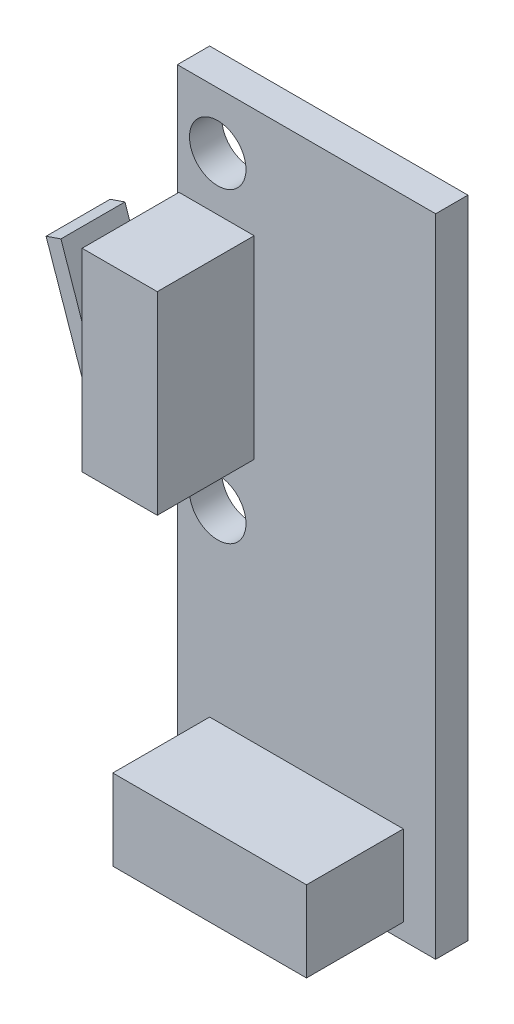
ISO-10303-21;
HEADER;
FILE_DESCRIPTION(('STEP AP214'),'2;1');
FILE_NAME('part.step','',(''),(''),'','','');
FILE_SCHEMA(('AUTOMOTIVE_DESIGN { 1 0 10303 214 1 1 1 1 }'));
ENDSEC;
DATA;
#1=APPLICATION_CONTEXT('core data for automotive mechanical design processes');
#2=APPLICATION_PROTOCOL_DEFINITION('international standard','automotive_design',2000,#1);
#3=PRODUCT_CONTEXT('',#1,'mechanical');
#4=PRODUCT('Part','Part','',(#3));
#5=PRODUCT_RELATED_PRODUCT_CATEGORY('part','',(#4));
#6=PRODUCT_DEFINITION_FORMATION('','',#4);
#7=PRODUCT_DEFINITION_CONTEXT('part definition',#1,'design');
#8=PRODUCT_DEFINITION('design','',#6,#7);
#9=PRODUCT_DEFINITION_SHAPE('','',#8);
#10=(LENGTH_UNIT() NAMED_UNIT(*) SI_UNIT(.MILLI.,.METRE.));
#11=(NAMED_UNIT(*) PLANE_ANGLE_UNIT() SI_UNIT($,.RADIAN.));
#12=(NAMED_UNIT(*) SI_UNIT($,.STERADIAN.) SOLID_ANGLE_UNIT());
#13=UNCERTAINTY_MEASURE_WITH_UNIT(LENGTH_MEASURE(1.E-05),#10,'distance_accuracy_value','');
#14=(GEOMETRIC_REPRESENTATION_CONTEXT(3) GLOBAL_UNCERTAINTY_ASSIGNED_CONTEXT((#13)) GLOBAL_UNIT_ASSIGNED_CONTEXT((#10,
#11,#12)) REPRESENTATION_CONTEXT('',''));
#15=CARTESIAN_POINT('',(0.,0.,0.));
#16=DIRECTION('',(0.,0.,1.));
#17=DIRECTION('',(1.,0.,0.));
#18=AXIS2_PLACEMENT_3D('',#15,#16,#17);
#19=CARTESIAN_POINT('',(0.,0.,2.));
#20=DIRECTION('',(0.,0.,1.));
#21=DIRECTION('',(1.,0.,0.));
#22=AXIS2_PLACEMENT_3D('',#19,#20,#21);
#23=PLANE('',#22);
#24=CARTESIAN_POINT('',(-5.50000000000001,16.5,2.));
#25=DIRECTION('',(0.,0.,1.));
#26=DIRECTION('',(1.,0.,0.));
#27=AXIS2_PLACEMENT_3D('',#24,#25,#26);
#28=CIRCLE('',#27,1.75);
#29=CARTESIAN_POINT('',(-3.75,16.5,2.));
#30=VERTEX_POINT('',#29);
#31=EDGE_CURVE('E239',#30,#30,#28,.T.);
#32=ORIENTED_EDGE('',*,*,#31,.F.);
#33=EDGE_LOOP('',(#32));
#34=FACE_BOUND('',#33,.T.);
#35=CARTESIAN_POINT('',(-5.50000000000001,-2.5,2.));
#36=DIRECTION('',(0.,0.,1.));
#37=DIRECTION('',(1.,0.,0.));
#38=AXIS2_PLACEMENT_3D('',#35,#36,#37);
#39=CIRCLE('',#38,1.75);
#40=CARTESIAN_POINT('',(-3.75000000000001,-2.5,2.));
#41=VERTEX_POINT('',#40);
#42=EDGE_CURVE('E234',#41,#41,#39,.T.);
#43=ORIENTED_EDGE('',*,*,#42,.F.);
#44=EDGE_LOOP('',(#43));
#45=FACE_BOUND('',#44,.T.);
#46=DIRECTION('',(0.,1.,0.));
#47=VECTOR('',#46,1.);
#48=CARTESIAN_POINT('',(7.99999999999999,20.,2.));
#49=LINE('',#48,#47);
#50=CARTESIAN_POINT('',(8.,-20.,2.));
#51=VERTEX_POINT('',#50);
#52=CARTESIAN_POINT('',(7.99999999999999,20.,2.));
#53=VERTEX_POINT('',#52);
#54=EDGE_CURVE('E247',#51,#53,#49,.T.);
#55=ORIENTED_EDGE('',*,*,#54,.T.);
#56=DIRECTION('',(-1.,0.,0.));
#57=VECTOR('',#56,1.);
#58=CARTESIAN_POINT('',(-8.00000000000001,20.,2.));
#59=LINE('',#58,#57);
#60=CARTESIAN_POINT('',(-8.00000000000001,20.,2.));
#61=VERTEX_POINT('',#60);
#62=EDGE_CURVE('E250',#53,#61,#59,.T.);
#63=ORIENTED_EDGE('',*,*,#62,.T.);
#64=DIRECTION('',(0.,-1.,0.));
#65=VECTOR('',#64,1.);
#66=CARTESIAN_POINT('',(-8.00000000000001,20.,2.));
#67=LINE('',#66,#65);
#68=CARTESIAN_POINT('',(-8.,-20.,2.));
#69=VERTEX_POINT('',#68);
#70=EDGE_CURVE('E253',#61,#69,#67,.T.);
#71=ORIENTED_EDGE('',*,*,#70,.T.);
#72=DIRECTION('',(1.,0.,0.));
#73=VECTOR('',#72,1.);
#74=CARTESIAN_POINT('',(-8.,-20.,2.));
#75=LINE('',#74,#73);
#76=EDGE_CURVE('E255',#69,#51,#75,.T.);
#77=ORIENTED_EDGE('',*,*,#76,.T.);
#78=EDGE_LOOP('',(#55,#63,#71,#77));
#79=FACE_BOUND('',#78,.T.);
#80=DIRECTION('',(1.,0.,0.));
#81=VECTOR('',#80,1.);
#82=CARTESIAN_POINT('',(-7.9,1.2,2.));
#83=LINE('',#82,#81);
#84=CARTESIAN_POINT('',(-7.9,1.2,2.));
#85=VERTEX_POINT('',#84);
#86=CARTESIAN_POINT('',(-3.24382025186022,1.2,2.));
#87=VERTEX_POINT('',#86);
#88=EDGE_CURVE('E219',#85,#87,#83,.T.);
#89=ORIENTED_EDGE('',*,*,#88,.F.);
#90=DIRECTION('',(0.,-1.,0.));
#91=VECTOR('',#90,1.);
#92=CARTESIAN_POINT('',(-7.90000000000001,13.2,2.));
#93=LINE('',#92,#91);
#94=CARTESIAN_POINT('',(-7.90000000000001,13.2,2.));
#95=VERTEX_POINT('',#94);
#96=EDGE_CURVE('E205',#95,#85,#93,.T.);
#97=ORIENTED_EDGE('',*,*,#96,.F.);
#98=DIRECTION('',(-1.,0.,0.));
#99=VECTOR('',#98,1.);
#100=CARTESIAN_POINT('',(-7.90000000000001,13.2,2.));
#101=LINE('',#100,#99);
#102=CARTESIAN_POINT('',(-3.24382025186023,13.2,2.));
#103=VERTEX_POINT('',#102);
#104=EDGE_CURVE('E210',#103,#95,#101,.T.);
#105=ORIENTED_EDGE('',*,*,#104,.F.);
#106=DIRECTION('',(0.,1.,0.));
#107=VECTOR('',#106,1.);
#108=CARTESIAN_POINT('',(-3.24382025186023,13.2,2.));
#109=LINE('',#108,#107);
#110=EDGE_CURVE('E221',#87,#103,#109,.T.);
#111=ORIENTED_EDGE('',*,*,#110,.F.);
#112=EDGE_LOOP('',(#89,#97,#105,#111));
#113=FACE_BOUND('',#112,.T.);
#114=DIRECTION('',(1.,0.,0.));
#115=VECTOR('',#114,1.);
#116=CARTESIAN_POINT('',(-6.,-19.,2.));
#117=LINE('',#116,#115);
#118=CARTESIAN_POINT('',(-6.,-19.,2.));
#119=VERTEX_POINT('',#118);
#120=CARTESIAN_POINT('',(6.,-19.,2.));
#121=VERTEX_POINT('',#120);
#122=EDGE_CURVE('E192',#119,#121,#117,.T.);
#123=ORIENTED_EDGE('',*,*,#122,.F.);
#124=DIRECTION('',(0.,-1.,0.));
#125=VECTOR('',#124,1.);
#126=CARTESIAN_POINT('',(-6.,-14.,2.));
#127=LINE('',#126,#125);
#128=CARTESIAN_POINT('',(-6.,-14.,2.));
#129=VERTEX_POINT('',#128);
#130=EDGE_CURVE('E174',#129,#119,#127,.T.);
#131=ORIENTED_EDGE('',*,*,#130,.F.);
#132=DIRECTION('',(-1.,0.,0.));
#133=VECTOR('',#132,1.);
#134=CARTESIAN_POINT('',(-6.,-14.,2.));
#135=LINE('',#134,#133);
#136=CARTESIAN_POINT('',(6.,-14.,2.));
#137=VERTEX_POINT('',#136);
#138=EDGE_CURVE('E183',#137,#129,#135,.T.);
#139=ORIENTED_EDGE('',*,*,#138,.F.);
#140=DIRECTION('',(0.,1.,0.));
#141=VECTOR('',#140,1.);
#142=CARTESIAN_POINT('',(6.,-14.,2.));
#143=LINE('',#142,#141);
#144=EDGE_CURVE('E194',#121,#137,#143,.T.);
#145=ORIENTED_EDGE('',*,*,#144,.F.);
#146=EDGE_LOOP('',(#123,#131,#139,#145));
#147=FACE_BOUND('',#146,.T.);
#148=ADVANCED_FACE('F34',(#34,#45,#79,#113,#147),#23,.T.);
#149=CARTESIAN_POINT('',(7.99999999999999,20.,2.));
#150=DIRECTION('',(-1.,0.,0.));
#151=DIRECTION('',(0.,-1.,0.));
#152=AXIS2_PLACEMENT_3D('',#149,#150,#151);
#153=PLANE('',#152);
#154=DIRECTION('',(0.,1.,0.));
#155=VECTOR('',#154,1.);
#156=CARTESIAN_POINT('',(7.99999999999999,20.,0.));
#157=LINE('',#156,#155);
#158=CARTESIAN_POINT('',(8.,-20.,0.));
#159=VERTEX_POINT('',#158);
#160=CARTESIAN_POINT('',(7.99999999999999,20.,0.));
#161=VERTEX_POINT('',#160);
#162=EDGE_CURVE('E238',#159,#161,#157,.T.);
#163=ORIENTED_EDGE('',*,*,#162,.T.);
#164=DIRECTION('',(0.,0.,-1.));
#165=VECTOR('',#164,1.);
#166=CARTESIAN_POINT('',(7.99999999999999,20.,2.));
#167=LINE('',#166,#165);
#168=EDGE_CURVE('E273',#53,#161,#167,.T.);
#169=ORIENTED_EDGE('',*,*,#168,.F.);
#170=ORIENTED_EDGE('',*,*,#54,.F.);
#171=DIRECTION('',(0.,0.,-1.));
#172=VECTOR('',#171,1.);
#173=CARTESIAN_POINT('',(8.,-20.,2.));
#174=LINE('',#173,#172);
#175=EDGE_CURVE('E257',#51,#159,#174,.T.);
#176=ORIENTED_EDGE('',*,*,#175,.T.);
#177=EDGE_LOOP('',(#163,#169,#170,#176));
#178=FACE_BOUND('',#177,.T.);
#179=ADVANCED_FACE('F36',(#178),#153,.F.);
#180=CARTESIAN_POINT('',(-8.00000000000001,20.,2.));
#181=DIRECTION('',(0.,-1.,0.));
#182=DIRECTION('',(0.,0.,-1.));
#183=AXIS2_PLACEMENT_3D('',#180,#181,#182);
#184=PLANE('',#183);
#185=DIRECTION('',(-1.,0.,0.));
#186=VECTOR('',#185,1.);
#187=CARTESIAN_POINT('',(-8.00000000000001,20.,0.));
#188=LINE('',#187,#186);
#189=CARTESIAN_POINT('',(-8.00000000000001,20.,0.));
#190=VERTEX_POINT('',#189);
#191=EDGE_CURVE('E260',#161,#190,#188,.T.);
#192=ORIENTED_EDGE('',*,*,#191,.T.);
#193=DIRECTION('',(0.,0.,-1.));
#194=VECTOR('',#193,1.);
#195=CARTESIAN_POINT('',(-8.00000000000001,20.,2.));
#196=LINE('',#195,#194);
#197=EDGE_CURVE('E270',#61,#190,#196,.T.);
#198=ORIENTED_EDGE('',*,*,#197,.F.);
#199=ORIENTED_EDGE('',*,*,#62,.F.);
#200=ORIENTED_EDGE('',*,*,#168,.T.);
#201=EDGE_LOOP('',(#192,#198,#199,#200));
#202=FACE_BOUND('',#201,.T.);
#203=ADVANCED_FACE('F301',(#202),#184,.F.);
#204=CARTESIAN_POINT('',(-8.00000000000001,20.,2.));
#205=DIRECTION('',(1.,0.,0.));
#206=DIRECTION('',(0.,1.,0.));
#207=AXIS2_PLACEMENT_3D('',#204,#205,#206);
#208=PLANE('',#207);
#209=DIRECTION('',(0.,-1.,0.));
#210=VECTOR('',#209,1.);
#211=CARTESIAN_POINT('',(-8.00000000000001,20.,0.));
#212=LINE('',#211,#210);
#213=CARTESIAN_POINT('',(-8.,-20.,0.));
#214=VERTEX_POINT('',#213);
#215=EDGE_CURVE('E262',#190,#214,#212,.T.);
#216=ORIENTED_EDGE('',*,*,#215,.T.);
#217=DIRECTION('',(0.,0.,-1.));
#218=VECTOR('',#217,1.);
#219=CARTESIAN_POINT('',(-8.,-20.,2.));
#220=LINE('',#219,#218);
#221=EDGE_CURVE('E267',#69,#214,#220,.T.);
#222=ORIENTED_EDGE('',*,*,#221,.F.);
#223=ORIENTED_EDGE('',*,*,#70,.F.);
#224=ORIENTED_EDGE('',*,*,#197,.T.);
#225=EDGE_LOOP('',(#216,#222,#223,#224));
#226=FACE_BOUND('',#225,.T.);
#227=ADVANCED_FACE('F316',(#226),#208,.F.);
#228=CARTESIAN_POINT('',(-8.,-20.,2.));
#229=DIRECTION('',(0.,1.,0.));
#230=DIRECTION('',(0.,0.,1.));
#231=AXIS2_PLACEMENT_3D('',#228,#229,#230);
#232=PLANE('',#231);
#233=DIRECTION('',(1.,0.,0.));
#234=VECTOR('',#233,1.);
#235=CARTESIAN_POINT('',(-8.,-20.,0.));
#236=LINE('',#235,#234);
#237=EDGE_CURVE('E251',#214,#159,#236,.T.);
#238=ORIENTED_EDGE('',*,*,#237,.T.);
#239=ORIENTED_EDGE('',*,*,#175,.F.);
#240=ORIENTED_EDGE('',*,*,#76,.F.);
#241=ORIENTED_EDGE('',*,*,#221,.T.);
#242=EDGE_LOOP('',(#238,#239,#240,#241));
#243=FACE_BOUND('',#242,.T.);
#244=ADVANCED_FACE('F312',(#243),#232,.F.);
#245=CARTESIAN_POINT('',(0.,0.,0.));
#246=DIRECTION('',(0.,0.,1.));
#247=DIRECTION('',(1.,0.,0.));
#248=AXIS2_PLACEMENT_3D('',#245,#246,#247);
#249=PLANE('',#248);
#250=CARTESIAN_POINT('',(-5.50000000000001,16.5,0.));
#251=DIRECTION('',(0.,0.,1.));
#252=DIRECTION('',(1.,0.,0.));
#253=AXIS2_PLACEMENT_3D('',#250,#251,#252);
#254=CIRCLE('',#253,1.75);
#255=CARTESIAN_POINT('',(-3.75,16.5,0.));
#256=VERTEX_POINT('',#255);
#257=EDGE_CURVE('E235',#256,#256,#254,.T.);
#258=ORIENTED_EDGE('',*,*,#257,.T.);
#259=EDGE_LOOP('',(#258));
#260=FACE_BOUND('',#259,.T.);
#261=CARTESIAN_POINT('',(-5.50000000000001,-2.5,0.));
#262=DIRECTION('',(0.,0.,1.));
#263=DIRECTION('',(1.,0.,0.));
#264=AXIS2_PLACEMENT_3D('',#261,#262,#263);
#265=CIRCLE('',#264,1.75);
#266=CARTESIAN_POINT('',(-3.75000000000001,-2.5,0.));
#267=VERTEX_POINT('',#266);
#268=EDGE_CURVE('E242',#267,#267,#265,.T.);
#269=ORIENTED_EDGE('',*,*,#268,.T.);
#270=EDGE_LOOP('',(#269));
#271=FACE_BOUND('',#270,.T.);
#272=ORIENTED_EDGE('',*,*,#162,.F.);
#273=ORIENTED_EDGE('',*,*,#237,.F.);
#274=ORIENTED_EDGE('',*,*,#215,.F.);
#275=ORIENTED_EDGE('',*,*,#191,.F.);
#276=EDGE_LOOP('',(#272,#273,#274,#275));
#277=FACE_BOUND('',#276,.T.);
#278=ADVANCED_FACE('F309',(#260,#271,#277),#249,.F.);
#279=CARTESIAN_POINT('',(-5.50000000000001,-2.5,0.));
#280=DIRECTION('',(0.,0.,1.));
#281=DIRECTION('',(1.,0.,0.));
#282=AXIS2_PLACEMENT_3D('',#279,#280,#281);
#283=CYLINDRICAL_SURFACE('',#282,1.75);
#284=ORIENTED_EDGE('',*,*,#268,.F.);
#285=EDGE_LOOP('',(#284));
#286=FACE_BOUND('',#285,.T.);
#287=ORIENTED_EDGE('',*,*,#42,.T.);
#288=EDGE_LOOP('',(#287));
#289=FACE_BOUND('',#288,.T.);
#290=ADVANCED_FACE('F307',(#286,#289),#283,.F.);
#291=CARTESIAN_POINT('',(-5.50000000000001,16.5,0.));
#292=DIRECTION('',(0.,0.,1.));
#293=DIRECTION('',(1.,0.,0.));
#294=AXIS2_PLACEMENT_3D('',#291,#292,#293);
#295=CYLINDRICAL_SURFACE('',#294,1.75);
#296=ORIENTED_EDGE('',*,*,#257,.F.);
#297=EDGE_LOOP('',(#296));
#298=FACE_BOUND('',#297,.T.);
#299=ORIENTED_EDGE('',*,*,#31,.T.);
#300=EDGE_LOOP('',(#299));
#301=FACE_BOUND('',#300,.T.);
#302=ADVANCED_FACE('F390',(#298,#301),#295,.F.);
#303=CARTESIAN_POINT('',(-7.90000000000001,13.2,8.));
#304=DIRECTION('',(1.,0.,0.));
#305=DIRECTION('',(0.,1.,0.));
#306=AXIS2_PLACEMENT_3D('',#303,#304,#305);
#307=PLANE('',#306);
#308=DIRECTION('',(0.,0.,1.));
#309=VECTOR('',#308,1.);
#310=CARTESIAN_POINT('',(-7.90000000000001,5.26034828455558,8.));
#311=LINE('',#310,#309);
#312=CARTESIAN_POINT('',(-7.9,5.26034828455558,3.0175001676389));
#313=VERTEX_POINT('',#312);
#314=CARTESIAN_POINT('',(-7.90000000000001,5.26034828455558,6.9824998323611));
#315=VERTEX_POINT('',#314);
#316=EDGE_CURVE('E42',#313,#315,#311,.T.);
#317=ORIENTED_EDGE('',*,*,#316,.T.);
#318=DIRECTION('',(0.,-1.,0.));
#319=VECTOR('',#318,1.);
#320=CARTESIAN_POINT('',(-7.90000000000001,13.2,6.9824998323611));
#321=LINE('',#320,#319);
#322=CARTESIAN_POINT('',(-7.9,2.27256172193852,6.9824998323611));
#323=VERTEX_POINT('',#322);
#324=EDGE_CURVE('E11',#315,#323,#321,.T.);
#325=ORIENTED_EDGE('',*,*,#324,.T.);
#326=DIRECTION('',(0.,0.,-1.));
#327=VECTOR('',#326,1.);
#328=CARTESIAN_POINT('',(-7.9,2.27256172193852,8.));
#329=LINE('',#328,#327);
#330=CARTESIAN_POINT('',(-7.9,2.27256172193852,3.0175001676389));
#331=VERTEX_POINT('',#330);
#332=EDGE_CURVE('E151',#323,#331,#329,.T.);
#333=ORIENTED_EDGE('',*,*,#332,.T.);
#334=DIRECTION('',(0.,1.,0.));
#335=VECTOR('',#334,1.);
#336=CARTESIAN_POINT('',(-7.90000000000001,13.2,3.0175001676389));
#337=LINE('',#336,#335);
#338=EDGE_CURVE('E277',#331,#313,#337,.T.);
#339=ORIENTED_EDGE('',*,*,#338,.T.);
#340=EDGE_LOOP('',(#317,#325,#333,#339));
#341=FACE_BOUND('',#340,.T.);
#342=ORIENTED_EDGE('',*,*,#96,.T.);
#343=DIRECTION('',(0.,0.,-1.));
#344=VECTOR('',#343,1.);
#345=CARTESIAN_POINT('',(-7.9,1.2,8.));
#346=LINE('',#345,#344);
#347=CARTESIAN_POINT('',(-7.9,1.2,8.));
#348=VERTEX_POINT('',#347);
#349=EDGE_CURVE('E232',#348,#85,#346,.T.);
#350=ORIENTED_EDGE('',*,*,#349,.F.);
#351=DIRECTION('',(0.,-1.,0.));
#352=VECTOR('',#351,1.);
#353=CARTESIAN_POINT('',(-7.90000000000001,13.2,8.));
#354=LINE('',#353,#352);
#355=CARTESIAN_POINT('',(-7.90000000000001,13.2,8.));
#356=VERTEX_POINT('',#355);
#357=EDGE_CURVE('E206',#356,#348,#354,.T.);
#358=ORIENTED_EDGE('',*,*,#357,.F.);
#359=DIRECTION('',(0.,0.,-1.));
#360=VECTOR('',#359,1.);
#361=CARTESIAN_POINT('',(-7.90000000000001,13.2,8.));
#362=LINE('',#361,#360);
#363=EDGE_CURVE('E216',#356,#95,#362,.T.);
#364=ORIENTED_EDGE('',*,*,#363,.T.);
#365=EDGE_LOOP('',(#342,#350,#358,#364));
#366=FACE_BOUND('',#365,.T.);
#367=ADVANCED_FACE('F281',(#341,#366),#307,.F.);
#368=CARTESIAN_POINT('',(-7.9,1.2,8.));
#369=DIRECTION('',(0.,1.,0.));
#370=DIRECTION('',(0.,0.,1.));
#371=AXIS2_PLACEMENT_3D('',#368,#369,#370);
#372=PLANE('',#371);
#373=ORIENTED_EDGE('',*,*,#88,.T.);
#374=DIRECTION('',(0.,0.,-1.));
#375=VECTOR('',#374,1.);
#376=CARTESIAN_POINT('',(-3.24382025186022,1.2,8.));
#377=LINE('',#376,#375);
#378=CARTESIAN_POINT('',(-3.24382025186022,1.2,8.));
#379=VERTEX_POINT('',#378);
#380=EDGE_CURVE('E229',#379,#87,#377,.T.);
#381=ORIENTED_EDGE('',*,*,#380,.F.);
#382=DIRECTION('',(1.,0.,0.));
#383=VECTOR('',#382,1.);
#384=CARTESIAN_POINT('',(-7.9,1.2,8.));
#385=LINE('',#384,#383);
#386=EDGE_CURVE('E209',#348,#379,#385,.T.);
#387=ORIENTED_EDGE('',*,*,#386,.F.);
#388=ORIENTED_EDGE('',*,*,#349,.T.);
#389=EDGE_LOOP('',(#373,#381,#387,#388));
#390=FACE_BOUND('',#389,.T.);
#391=ADVANCED_FACE('F384',(#390),#372,.F.);
#392=CARTESIAN_POINT('',(-3.24382025186023,13.2,8.));
#393=DIRECTION('',(-1.,0.,0.));
#394=DIRECTION('',(0.,-1.,0.));
#395=AXIS2_PLACEMENT_3D('',#392,#393,#394);
#396=PLANE('',#395);
#397=ORIENTED_EDGE('',*,*,#110,.T.);
#398=DIRECTION('',(0.,0.,-1.));
#399=VECTOR('',#398,1.);
#400=CARTESIAN_POINT('',(-3.24382025186023,13.2,8.));
#401=LINE('',#400,#399);
#402=CARTESIAN_POINT('',(-3.24382025186023,13.2,8.));
#403=VERTEX_POINT('',#402);
#404=EDGE_CURVE('E227',#403,#103,#401,.T.);
#405=ORIENTED_EDGE('',*,*,#404,.F.);
#406=DIRECTION('',(0.,1.,0.));
#407=VECTOR('',#406,1.);
#408=CARTESIAN_POINT('',(-3.24382025186023,13.2,8.));
#409=LINE('',#408,#407);
#410=EDGE_CURVE('E212',#379,#403,#409,.T.);
#411=ORIENTED_EDGE('',*,*,#410,.F.);
#412=ORIENTED_EDGE('',*,*,#380,.T.);
#413=EDGE_LOOP('',(#397,#405,#411,#412));
#414=FACE_BOUND('',#413,.T.);
#415=ADVANCED_FACE('F380',(#414),#396,.F.);
#416=CARTESIAN_POINT('',(-7.90000000000001,13.2,8.));
#417=DIRECTION('',(0.,-1.,0.));
#418=DIRECTION('',(0.,0.,-1.));
#419=AXIS2_PLACEMENT_3D('',#416,#417,#418);
#420=PLANE('',#419);
#421=ORIENTED_EDGE('',*,*,#104,.T.);
#422=ORIENTED_EDGE('',*,*,#363,.F.);
#423=DIRECTION('',(-1.,0.,0.));
#424=VECTOR('',#423,1.);
#425=CARTESIAN_POINT('',(-7.90000000000001,13.2,8.));
#426=LINE('',#425,#424);
#427=EDGE_CURVE('E214',#403,#356,#426,.T.);
#428=ORIENTED_EDGE('',*,*,#427,.F.);
#429=ORIENTED_EDGE('',*,*,#404,.T.);
#430=EDGE_LOOP('',(#421,#422,#428,#429));
#431=FACE_BOUND('',#430,.T.);
#432=ADVANCED_FACE('F376',(#431),#420,.F.);
#433=CARTESIAN_POINT('',(0.,0.,8.));
#434=DIRECTION('',(0.,0.,1.));
#435=DIRECTION('',(1.,0.,0.));
#436=AXIS2_PLACEMENT_3D('',#433,#434,#435);
#437=PLANE('',#436);
#438=ORIENTED_EDGE('',*,*,#357,.T.);
#439=ORIENTED_EDGE('',*,*,#386,.T.);
#440=ORIENTED_EDGE('',*,*,#410,.T.);
#441=ORIENTED_EDGE('',*,*,#427,.T.);
#442=EDGE_LOOP('',(#438,#439,#440,#441));
#443=FACE_BOUND('',#442,.T.);
#444=ADVANCED_FACE('F373',(#443),#437,.T.);
#445=CARTESIAN_POINT('',(-6.,-14.,8.));
#446=DIRECTION('',(1.,0.,0.));
#447=DIRECTION('',(0.,1.,0.));
#448=AXIS2_PLACEMENT_3D('',#445,#446,#447);
#449=PLANE('',#448);
#450=ORIENTED_EDGE('',*,*,#130,.T.);
#451=DIRECTION('',(0.,0.,-1.));
#452=VECTOR('',#451,1.);
#453=CARTESIAN_POINT('',(-6.,-19.,8.));
#454=LINE('',#453,#452);
#455=CARTESIAN_POINT('',(-6.,-19.,8.));
#456=VERTEX_POINT('',#455);
#457=EDGE_CURVE('E203',#456,#119,#454,.T.);
#458=ORIENTED_EDGE('',*,*,#457,.F.);
#459=DIRECTION('',(0.,-1.,0.));
#460=VECTOR('',#459,1.);
#461=CARTESIAN_POINT('',(-6.,-14.,8.));
#462=LINE('',#461,#460);
#463=CARTESIAN_POINT('',(-6.,-14.,8.));
#464=VERTEX_POINT('',#463);
#465=EDGE_CURVE('E179',#464,#456,#462,.T.);
#466=ORIENTED_EDGE('',*,*,#465,.F.);
#467=DIRECTION('',(0.,0.,-1.));
#468=VECTOR('',#467,1.);
#469=CARTESIAN_POINT('',(-6.,-14.,8.));
#470=LINE('',#469,#468);
#471=EDGE_CURVE('E189',#464,#129,#470,.T.);
#472=ORIENTED_EDGE('',*,*,#471,.T.);
#473=EDGE_LOOP('',(#450,#458,#466,#472));
#474=FACE_BOUND('',#473,.T.);
#475=ADVANCED_FACE('F357',(#474),#449,.F.);
#476=CARTESIAN_POINT('',(-6.,-19.,8.));
#477=DIRECTION('',(0.,1.,0.));
#478=DIRECTION('',(0.,0.,1.));
#479=AXIS2_PLACEMENT_3D('',#476,#477,#478);
#480=PLANE('',#479);
#481=ORIENTED_EDGE('',*,*,#122,.T.);
#482=DIRECTION('',(0.,0.,-1.));
#483=VECTOR('',#482,1.);
#484=CARTESIAN_POINT('',(6.,-19.,8.));
#485=LINE('',#484,#483);
#486=CARTESIAN_POINT('',(6.,-19.,8.));
#487=VERTEX_POINT('',#486);
#488=EDGE_CURVE('E200',#487,#121,#485,.T.);
#489=ORIENTED_EDGE('',*,*,#488,.F.);
#490=DIRECTION('',(1.,0.,0.));
#491=VECTOR('',#490,1.);
#492=CARTESIAN_POINT('',(-6.,-19.,8.));
#493=LINE('',#492,#491);
#494=EDGE_CURVE('E182',#456,#487,#493,.T.);
#495=ORIENTED_EDGE('',*,*,#494,.F.);
#496=ORIENTED_EDGE('',*,*,#457,.T.);
#497=EDGE_LOOP('',(#481,#489,#495,#496));
#498=FACE_BOUND('',#497,.T.);
#499=ADVANCED_FACE('F347',(#498),#480,.F.);
#500=CARTESIAN_POINT('',(6.,-14.,8.));
#501=DIRECTION('',(-1.,0.,0.));
#502=DIRECTION('',(0.,-1.,0.));
#503=AXIS2_PLACEMENT_3D('',#500,#501,#502);
#504=PLANE('',#503);
#505=ORIENTED_EDGE('',*,*,#144,.T.);
#506=DIRECTION('',(0.,0.,-1.));
#507=VECTOR('',#506,1.);
#508=CARTESIAN_POINT('',(6.,-14.,8.));
#509=LINE('',#508,#507);
#510=CARTESIAN_POINT('',(6.,-14.,8.));
#511=VERTEX_POINT('',#510);
#512=EDGE_CURVE('E57',#511,#137,#509,.T.);
#513=ORIENTED_EDGE('',*,*,#512,.F.);
#514=DIRECTION('',(0.,1.,0.));
#515=VECTOR('',#514,1.);
#516=CARTESIAN_POINT('',(6.,-14.,8.));
#517=LINE('',#516,#515);
#518=EDGE_CURVE('E185',#487,#511,#517,.T.);
#519=ORIENTED_EDGE('',*,*,#518,.F.);
#520=ORIENTED_EDGE('',*,*,#488,.T.);
#521=EDGE_LOOP('',(#505,#513,#519,#520));
#522=FACE_BOUND('',#521,.T.);
#523=ADVANCED_FACE('F351',(#522),#504,.F.);
#524=CARTESIAN_POINT('',(-6.,-14.,8.));
#525=DIRECTION('',(0.,-1.,0.));
#526=DIRECTION('',(1.,0.,0.));
#527=AXIS2_PLACEMENT_3D('',#524,#525,#526);
#528=PLANE('',#527);
#529=ORIENTED_EDGE('',*,*,#138,.T.);
#530=ORIENTED_EDGE('',*,*,#471,.F.);
#531=DIRECTION('',(-1.,0.,0.));
#532=VECTOR('',#531,1.);
#533=CARTESIAN_POINT('',(-6.,-14.,8.));
#534=LINE('',#533,#532);
#535=EDGE_CURVE('E187',#511,#464,#534,.T.);
#536=ORIENTED_EDGE('',*,*,#535,.F.);
#537=ORIENTED_EDGE('',*,*,#512,.T.);
#538=EDGE_LOOP('',(#529,#530,#536,#537));
#539=FACE_BOUND('',#538,.T.);
#540=ADVANCED_FACE('F358',(#539),#528,.F.);
#541=CARTESIAN_POINT('',(0.,0.,8.));
#542=DIRECTION('',(0.,0.,1.));
#543=DIRECTION('',(1.,0.,0.));
#544=AXIS2_PLACEMENT_3D('',#541,#542,#543);
#545=PLANE('',#544);
#546=ORIENTED_EDGE('',*,*,#465,.T.);
#547=ORIENTED_EDGE('',*,*,#494,.T.);
#548=ORIENTED_EDGE('',*,*,#518,.T.);
#549=ORIENTED_EDGE('',*,*,#535,.T.);
#550=EDGE_LOOP('',(#546,#547,#548,#549));
#551=FACE_BOUND('',#550,.T.);
#552=ADVANCED_FACE('F353',(#551),#545,.T.);
#553=CARTESIAN_POINT('',(-10.2303149173825,12.028074216028,6.9824998323611));
#554=DIRECTION('',(0.,0.,1.));
#555=DIRECTION('',(1.,0.,0.));
#556=AXIS2_PLACEMENT_3D('',#553,#554,#555);
#557=PLANE('',#556);
#558=ORIENTED_EDGE('',*,*,#324,.F.);
#559=DIRECTION('',(0.325568154457154,-0.945518575599318,0.));
#560=VECTOR('',#559,1.);
#561=CARTESIAN_POINT('',(-10.2303149173825,12.028074216028,6.9824998323611));
#562=LINE('',#561,#560);
#563=CARTESIAN_POINT('',(-10.2303149173825,12.028074216028,6.9824998323611));
#564=VERTEX_POINT('',#563);
#565=EDGE_CURVE('E168',#564,#315,#562,.T.);
#566=ORIENTED_EDGE('',*,*,#565,.F.);
#567=DIRECTION('',(-0.945518575599318,-0.325568154457153,0.));
#568=VECTOR('',#567,1.);
#569=CARTESIAN_POINT('',(-10.2303149173825,12.028074216028,6.9824998323611));
#570=LINE('',#569,#568);
#571=CARTESIAN_POINT('',(-11.150047458932,11.7113849051314,6.9824998323611));
#572=VERTEX_POINT('',#571);
#573=EDGE_CURVE('E161',#564,#572,#570,.T.);
#574=ORIENTED_EDGE('',*,*,#573,.T.);
#575=DIRECTION('',(0.325568154457154,-0.945518575599318,0.));
#576=VECTOR('',#575,1.);
#577=CARTESIAN_POINT('',(-11.150047458932,11.7113849051314,6.9824998323611));
#578=LINE('',#577,#576);
#579=EDGE_CURVE('E146',#572,#323,#578,.T.);
#580=ORIENTED_EDGE('',*,*,#579,.T.);
#581=EDGE_LOOP('',(#558,#566,#574,#580));
#582=FACE_BOUND('',#581,.T.);
#583=ADVANCED_FACE('F166',(#582),#557,.T.);
#584=CARTESIAN_POINT('',(-10.2303149173825,12.028074216028,6.9824998323611));
#585=DIRECTION('',(0.945518575599318,0.325568154457154,0.));
#586=DIRECTION('',(-0.325568154457154,0.945518575599318,0.));
#587=AXIS2_PLACEMENT_3D('',#584,#585,#586);
#588=PLANE('',#587);
#589=ORIENTED_EDGE('',*,*,#316,.F.);
#590=DIRECTION('',(0.325568154457154,-0.945518575599318,0.));
#591=VECTOR('',#590,1.);
#592=CARTESIAN_POINT('',(-10.2303149173825,12.028074216028,3.0175001676389));
#593=LINE('',#592,#591);
#594=CARTESIAN_POINT('',(-10.2303149173825,12.028074216028,3.0175001676389));
#595=VERTEX_POINT('',#594);
#596=EDGE_CURVE('E175',#595,#313,#593,.T.);
#597=ORIENTED_EDGE('',*,*,#596,.F.);
#598=DIRECTION('',(0.,0.,1.));
#599=VECTOR('',#598,1.);
#600=CARTESIAN_POINT('',(-10.2303149173825,12.028074216028,6.9824998323611));
#601=LINE('',#600,#599);
#602=EDGE_CURVE('E154',#595,#564,#601,.T.);
#603=ORIENTED_EDGE('',*,*,#602,.T.);
#604=ORIENTED_EDGE('',*,*,#565,.T.);
#605=EDGE_LOOP('',(#589,#597,#603,#604));
#606=FACE_BOUND('',#605,.T.);
#607=ADVANCED_FACE('F284',(#606),#588,.T.);
#608=CARTESIAN_POINT('',(-10.2303149173825,12.028074216028,3.0175001676389));
#609=DIRECTION('',(0.,0.,-1.));
#610=DIRECTION('',(-1.,0.,0.));
#611=AXIS2_PLACEMENT_3D('',#608,#609,#610);
#612=PLANE('',#611);
#613=ORIENTED_EDGE('',*,*,#338,.F.);
#614=DIRECTION('',(0.325568154457154,-0.945518575599318,0.));
#615=VECTOR('',#614,1.);
#616=CARTESIAN_POINT('',(-11.150047458932,11.7113849051314,3.0175001676389));
#617=LINE('',#616,#615);
#618=CARTESIAN_POINT('',(-11.150047458932,11.7113849051314,3.0175001676389));
#619=VERTEX_POINT('',#618);
#620=EDGE_CURVE('E49',#619,#331,#617,.T.);
#621=ORIENTED_EDGE('',*,*,#620,.F.);
#622=DIRECTION('',(0.945518575599318,0.325568154457153,0.));
#623=VECTOR('',#622,1.);
#624=CARTESIAN_POINT('',(-10.2303149173825,12.028074216028,3.0175001676389));
#625=LINE('',#624,#623);
#626=EDGE_CURVE('E164',#619,#595,#625,.T.);
#627=ORIENTED_EDGE('',*,*,#626,.T.);
#628=ORIENTED_EDGE('',*,*,#596,.T.);
#629=EDGE_LOOP('',(#613,#621,#627,#628));
#630=FACE_BOUND('',#629,.T.);
#631=ADVANCED_FACE('F286',(#630),#612,.T.);
#632=CARTESIAN_POINT('',(-11.150047458932,11.7113849051314,6.9824998323611));
#633=DIRECTION('',(-0.945518575599318,-0.325568154457154,0.));
#634=DIRECTION('',(0.325568154457154,-0.945518575599318,0.));
#635=AXIS2_PLACEMENT_3D('',#632,#633,#634);
#636=PLANE('',#635);
#637=ORIENTED_EDGE('',*,*,#332,.F.);
#638=ORIENTED_EDGE('',*,*,#579,.F.);
#639=DIRECTION('',(0.,0.,-1.));
#640=VECTOR('',#639,1.);
#641=CARTESIAN_POINT('',(-11.150047458932,11.7113849051314,6.9824998323611));
#642=LINE('',#641,#640);
#643=EDGE_CURVE('E149',#572,#619,#642,.T.);
#644=ORIENTED_EDGE('',*,*,#643,.T.);
#645=ORIENTED_EDGE('',*,*,#620,.T.);
#646=EDGE_LOOP('',(#637,#638,#644,#645));
#647=FACE_BOUND('',#646,.T.);
#648=ADVANCED_FACE('F148',(#647),#636,.T.);
#649=CARTESIAN_POINT('',(-4.78696933343401,13.9023684092598,0.));
#650=DIRECTION('',(0.325568154457153,-0.945518575599318,0.));
#651=DIRECTION('',(0.945518575599318,0.325568154457153,0.));
#652=AXIS2_PLACEMENT_3D('',#649,#650,#651);
#653=PLANE('',#652);
#654=ORIENTED_EDGE('',*,*,#573,.F.);
#655=ORIENTED_EDGE('',*,*,#602,.F.);
#656=ORIENTED_EDGE('',*,*,#626,.F.);
#657=ORIENTED_EDGE('',*,*,#643,.F.);
#658=EDGE_LOOP('',(#654,#655,#656,#657));
#659=FACE_BOUND('',#658,.T.);
#660=ADVANCED_FACE('F159',(#659),#653,.F.);
#661=CLOSED_SHELL('',(#148,#179,#203,#227,#244,#278,#290,#302,#367,#391,#415,#432,#444,#475,
#499,#523,#540,#552,#583,#607,#631,#648,#660));
#662=MANIFOLD_SOLID_BREP('B2',#661);
#663=ADVANCED_BREP_SHAPE_REPRESENTATION('',(#18,#662),#14);
#664=SHAPE_DEFINITION_REPRESENTATION(#9,#663);
ENDSEC;
END-ISO-10303-21;
